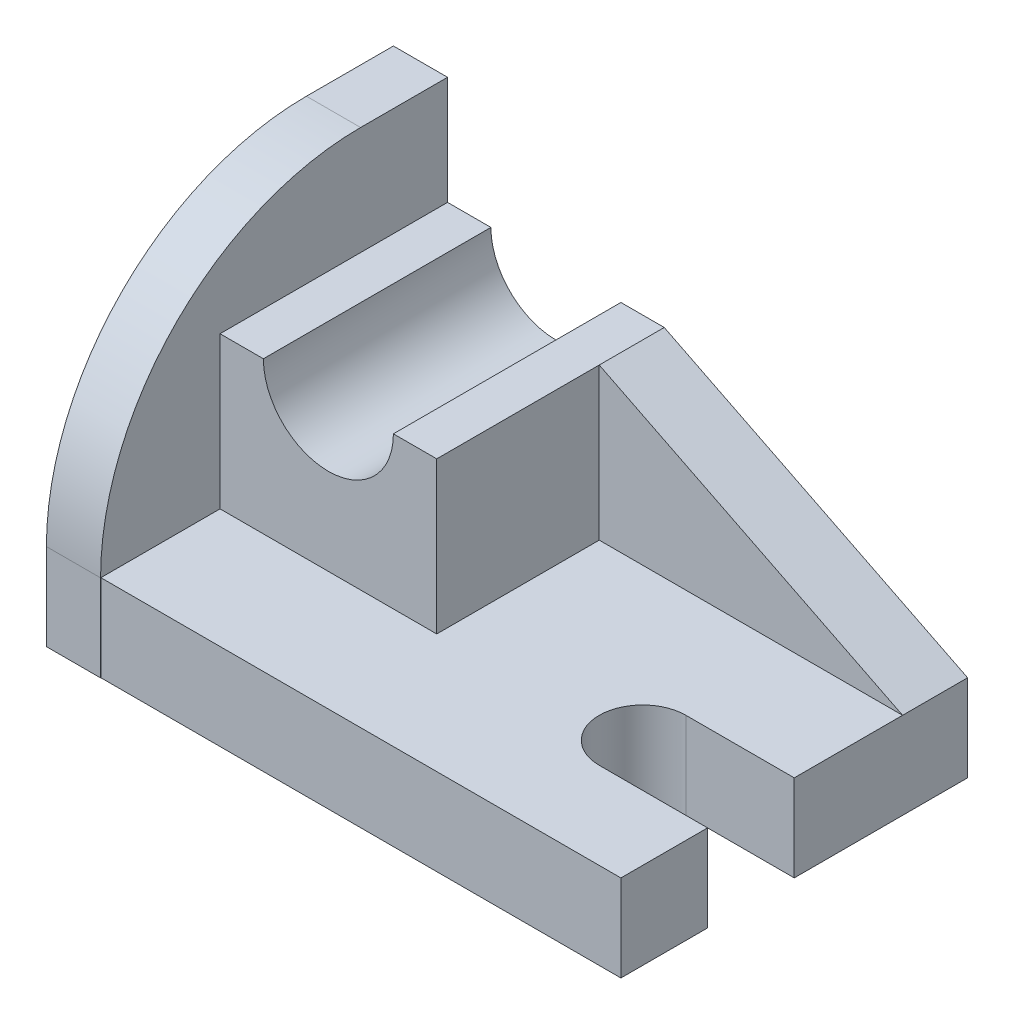
ISO-10303-21;
HEADER;
FILE_DESCRIPTION(('STEP AP214'),'2;1');
FILE_NAME('part.step','',(''),(''),'','','');
FILE_SCHEMA(('AUTOMOTIVE_DESIGN { 1 0 10303 214 1 1 1 1 }'));
ENDSEC;
DATA;
#1=APPLICATION_CONTEXT('core data for automotive mechanical design processes');
#2=APPLICATION_PROTOCOL_DEFINITION('international standard','automotive_design',2000,#1);
#3=PRODUCT_CONTEXT('',#1,'mechanical');
#4=PRODUCT('Part','Part','',(#3));
#5=PRODUCT_RELATED_PRODUCT_CATEGORY('part','',(#4));
#6=PRODUCT_DEFINITION_FORMATION('','',#4);
#7=PRODUCT_DEFINITION_CONTEXT('part definition',#1,'design');
#8=PRODUCT_DEFINITION('design','',#6,#7);
#9=PRODUCT_DEFINITION_SHAPE('','',#8);
#10=(LENGTH_UNIT() NAMED_UNIT(*) SI_UNIT(.MILLI.,.METRE.));
#11=(NAMED_UNIT(*) PLANE_ANGLE_UNIT() SI_UNIT($,.RADIAN.));
#12=(NAMED_UNIT(*) SI_UNIT($,.STERADIAN.) SOLID_ANGLE_UNIT());
#13=UNCERTAINTY_MEASURE_WITH_UNIT(LENGTH_MEASURE(1.E-05),#10,'distance_accuracy_value','');
#14=(GEOMETRIC_REPRESENTATION_CONTEXT(3) GLOBAL_UNCERTAINTY_ASSIGNED_CONTEXT((#13)) GLOBAL_UNIT_ASSIGNED_CONTEXT((#10,
#11,#12)) REPRESENTATION_CONTEXT('',''));
#15=CARTESIAN_POINT('',(0.,0.,0.));
#16=DIRECTION('',(0.,0.,1.));
#17=DIRECTION('',(1.,0.,0.));
#18=AXIS2_PLACEMENT_3D('',#15,#16,#17);
#19=CARTESIAN_POINT('',(0.,406.4,0.));
#20=DIRECTION('',(0.,-1.,0.));
#21=DIRECTION('',(0.,0.,-1.));
#22=AXIS2_PLACEMENT_3D('',#19,#20,#21);
#23=PLANE('',#22);
#24=DIRECTION('',(-1.,0.,0.));
#25=VECTOR('',#24,1.);
#26=CARTESIAN_POINT('',(2451.4745308311,406.4,-793.460589812333));
#27=LINE('',#26,#25);
#28=CARTESIAN_POINT('',(2451.4745308311,406.4,-793.460589812333));
#29=VERTEX_POINT('',#28);
#30=CARTESIAN_POINT('',(1029.0745308311,406.4,-793.460589812333));
#31=VERTEX_POINT('',#30);
#32=EDGE_CURVE('E166',#29,#31,#27,.T.);
#33=ORIENTED_EDGE('',*,*,#32,.T.);
#34=DIRECTION('',(0.,0.,-1.));
#35=VECTOR('',#34,1.);
#36=CARTESIAN_POINT('',(1029.0745308311,406.4,-1098.26058981233));
#37=LINE('',#36,#35);
#38=CARTESIAN_POINT('',(1029.0745308311,406.4,-31.4605898123326));
#39=VERTEX_POINT('',#38);
#40=EDGE_CURVE('E61',#39,#31,#37,.T.);
#41=ORIENTED_EDGE('',*,*,#40,.F.);
#42=DIRECTION('',(1.,0.,0.));
#43=VECTOR('',#42,1.);
#44=CARTESIAN_POINT('',(13.0745308310987,406.4,-31.4605898123326));
#45=LINE('',#44,#43);
#46=CARTESIAN_POINT('',(13.0745308310987,406.4,-31.4605898123326));
#47=VERTEX_POINT('',#46);
#48=EDGE_CURVE('E185',#47,#39,#45,.T.);
#49=ORIENTED_EDGE('',*,*,#48,.F.);
#50=DIRECTION('',(0.,0.,1.));
#51=VECTOR('',#50,1.);
#52=CARTESIAN_POINT('',(13.0745308310987,406.4,527.339410187667));
#53=LINE('',#52,#51);
#54=CARTESIAN_POINT('',(13.0745308310987,406.4,527.339410187667));
#55=VERTEX_POINT('',#54);
#56=EDGE_CURVE('E260',#47,#55,#53,.T.);
#57=ORIENTED_EDGE('',*,*,#56,.T.);
#58=DIRECTION('',(1.,0.,0.));
#59=VECTOR('',#58,1.);
#60=CARTESIAN_POINT('',(13.0745308310987,406.4,527.339410187667));
#61=LINE('',#60,#59);
#62=CARTESIAN_POINT('',(2451.4745308311,406.4,527.339410187667));
#63=VERTEX_POINT('',#62);
#64=EDGE_CURVE('E262',#55,#63,#61,.T.);
#65=ORIENTED_EDGE('',*,*,#64,.T.);
#66=DIRECTION('',(0.,0.,-1.));
#67=VECTOR('',#66,1.);
#68=CARTESIAN_POINT('',(2451.4745308311,406.4,527.339410187667));
#69=LINE('',#68,#67);
#70=CARTESIAN_POINT('',(2451.4745308311,406.4,120.939410187667));
#71=VERTEX_POINT('',#70);
#72=EDGE_CURVE('E265',#63,#71,#69,.T.);
#73=ORIENTED_EDGE('',*,*,#72,.T.);
#74=DIRECTION('',(1.,0.,0.));
#75=VECTOR('',#74,1.);
#76=CARTESIAN_POINT('',(2451.4745308311,406.4,120.939410187667));
#77=LINE('',#76,#75);
#78=CARTESIAN_POINT('',(1943.4745308311,406.4,120.939410187667));
#79=VERTEX_POINT('',#78);
#80=EDGE_CURVE('E238',#79,#71,#77,.T.);
#81=ORIENTED_EDGE('',*,*,#80,.F.);
#82=CARTESIAN_POINT('',(1943.4745308311,406.4,-82.2605898123326));
#83=DIRECTION('',(0.,1.,0.));
#84=DIRECTION('',(0.,0.,1.));
#85=AXIS2_PLACEMENT_3D('',#82,#83,#84);
#86=CIRCLE('',#85,203.2);
#87=CARTESIAN_POINT('',(1943.4745308311,406.4,-285.460589812333));
#88=VERTEX_POINT('',#87);
#89=EDGE_CURVE('E247',#88,#79,#86,.T.);
#90=ORIENTED_EDGE('',*,*,#89,.F.);
#91=DIRECTION('',(-1.,0.,0.));
#92=VECTOR('',#91,1.);
#93=CARTESIAN_POINT('',(2451.4745308311,406.4,-285.460589812333));
#94=LINE('',#93,#92);
#95=CARTESIAN_POINT('',(2451.4745308311,406.4,-285.460589812333));
#96=VERTEX_POINT('',#95);
#97=EDGE_CURVE('E233',#96,#88,#94,.T.);
#98=ORIENTED_EDGE('',*,*,#97,.F.);
#99=EDGE_CURVE('E177',#96,#29,#69,.T.);
#100=ORIENTED_EDGE('',*,*,#99,.T.);
#101=EDGE_LOOP('',(#33,#41,#49,#57,#65,#73,#81,#90,#98,#100));
#102=FACE_BOUND('',#101,.T.);
#103=ADVANCED_FACE('F39',(#102),#23,.F.);
#104=CARTESIAN_POINT('',(1029.0745308311,1117.6,-1098.26058981233));
#105=DIRECTION('',(-1.,0.,0.));
#106=DIRECTION('',(0.,0.,1.));
#107=AXIS2_PLACEMENT_3D('',#104,#105,#106);
#108=PLANE('',#107);
#109=DIRECTION('',(0.,1.,0.));
#110=VECTOR('',#109,1.);
#111=CARTESIAN_POINT('',(1029.0745308311,406.4,-793.460589812333));
#112=LINE('',#111,#110);
#113=CARTESIAN_POINT('',(1029.0745308311,1117.6,-793.460589812333));
#114=VERTEX_POINT('',#113);
#115=EDGE_CURVE('E164',#31,#114,#112,.T.);
#116=ORIENTED_EDGE('',*,*,#115,.T.);
#117=DIRECTION('',(0.,0.,-1.));
#118=VECTOR('',#117,1.);
#119=CARTESIAN_POINT('',(1029.0745308311,1117.6,-1098.26058981233));
#120=LINE('',#119,#118);
#121=CARTESIAN_POINT('',(1029.0745308311,1117.6,-31.4605898123326));
#122=VERTEX_POINT('',#121);
#123=EDGE_CURVE('E298',#122,#114,#120,.T.);
#124=ORIENTED_EDGE('',*,*,#123,.F.);
#125=DIRECTION('',(0.,-1.,0.));
#126=VECTOR('',#125,1.);
#127=CARTESIAN_POINT('',(1029.0745308311,1117.6,-31.4605898123326));
#128=LINE('',#127,#126);
#129=EDGE_CURVE('E183',#122,#39,#128,.T.);
#130=ORIENTED_EDGE('',*,*,#129,.T.);
#131=ORIENTED_EDGE('',*,*,#40,.T.);
#132=EDGE_LOOP('',(#116,#124,#130,#131));
#133=FACE_BOUND('',#132,.T.);
#134=ADVANCED_FACE('F181',(#133),#108,.F.);
#135=CARTESIAN_POINT('',(0.,1117.6,0.));
#136=DIRECTION('',(0.,1.,0.));
#137=DIRECTION('',(0.,0.,1.));
#138=AXIS2_PLACEMENT_3D('',#135,#136,#137);
#139=PLANE('',#138);
#140=DIRECTION('',(0.,0.,1.));
#141=VECTOR('',#140,1.);
#142=CARTESIAN_POINT('',(216.274530831099,1117.6,-1098.26058981233));
#143=LINE('',#142,#141);
#144=CARTESIAN_POINT('',(216.274530831099,1117.6,-1098.26058981233));
#145=VERTEX_POINT('',#144);
#146=CARTESIAN_POINT('',(216.274530831099,1117.6,-31.4605898123326));
#147=VERTEX_POINT('',#146);
#148=EDGE_CURVE('E11',#145,#147,#143,.T.);
#149=ORIENTED_EDGE('',*,*,#148,.F.);
#150=DIRECTION('',(-1.,0.,0.));
#151=VECTOR('',#150,1.);
#152=CARTESIAN_POINT('',(13.0745308310987,1117.6,-1098.26058981233));
#153=LINE('',#152,#151);
#154=CARTESIAN_POINT('',(13.0745308310987,1117.6,-1098.26058981233));
#155=VERTEX_POINT('',#154);
#156=EDGE_CURVE('E293',#145,#155,#153,.T.);
#157=ORIENTED_EDGE('',*,*,#156,.T.);
#158=DIRECTION('',(0.,0.,1.));
#159=VECTOR('',#158,1.);
#160=CARTESIAN_POINT('',(13.0745308310987,1117.6,-1098.26058981233));
#161=LINE('',#160,#159);
#162=CARTESIAN_POINT('',(13.0745308310987,1117.6,-31.4605898123326));
#163=VERTEX_POINT('',#162);
#164=EDGE_CURVE('E184',#155,#163,#161,.T.);
#165=ORIENTED_EDGE('',*,*,#164,.T.);
#166=DIRECTION('',(1.,0.,0.));
#167=VECTOR('',#166,1.);
#168=CARTESIAN_POINT('',(13.0745308310987,1117.6,-31.4605898123326));
#169=LINE('',#168,#167);
#170=EDGE_CURVE('E301',#163,#147,#169,.T.);
#171=ORIENTED_EDGE('',*,*,#170,.T.);
#172=EDGE_LOOP('',(#149,#157,#165,#171));
#173=FACE_BOUND('',#172,.T.);
#174=ADVANCED_FACE('F340',(#173),#139,.T.);
#175=CARTESIAN_POINT('',(13.0745308310987,406.4,-690.477583060082));
#176=DIRECTION('',(1.,0.,0.));
#177=DIRECTION('',(0.,0.,-1.));
#178=AXIS2_PLACEMENT_3D('',#175,#176,#177);
#179=PLANE('',#178);
#180=ORIENTED_EDGE('',*,*,#56,.F.);
#181=DIRECTION('',(0.,-1.,0.));
#182=VECTOR('',#181,1.);
#183=CARTESIAN_POINT('',(13.0745308310987,1117.6,-31.4605898123326));
#184=LINE('',#183,#182);
#185=EDGE_CURVE('E195',#163,#47,#184,.T.);
#186=ORIENTED_EDGE('',*,*,#185,.F.);
#187=ORIENTED_EDGE('',*,*,#164,.F.);
#188=DIRECTION('',(0.,-1.,0.));
#189=VECTOR('',#188,1.);
#190=CARTESIAN_POINT('',(13.0745308310987,0.,-1098.26058981233));
#191=LINE('',#190,#189);
#192=CARTESIAN_POINT('',(13.0745308310987,1625.6,-1098.26058981233));
#193=VERTEX_POINT('',#192);
#194=EDGE_CURVE('E199',#193,#155,#191,.T.);
#195=ORIENTED_EDGE('',*,*,#194,.F.);
#196=DIRECTION('',(0.,0.,-1.));
#197=VECTOR('',#196,1.);
#198=CARTESIAN_POINT('',(13.0745308310987,1625.6,-1098.26058981233));
#199=LINE('',#198,#197);
#200=CARTESIAN_POINT('',(13.0745308310987,1625.6,-690.477583060091));
#201=VERTEX_POINT('',#200);
#202=EDGE_CURVE('E204',#201,#193,#199,.T.);
#203=ORIENTED_EDGE('',*,*,#202,.F.);
#204=CARTESIAN_POINT('',(13.0745308310987,406.4,-690.477583060082));
#205=DIRECTION('',(-1.,0.,0.));
#206=DIRECTION('',(0.,0.,-1.));
#207=AXIS2_PLACEMENT_3D('',#204,#205,#206);
#208=CIRCLE('',#207,1219.2);
#209=CARTESIAN_POINT('',(13.0745308310987,406.399999999991,528.722416939918));
#210=VERTEX_POINT('',#209);
#211=EDGE_CURVE('E219',#210,#201,#208,.T.);
#212=ORIENTED_EDGE('',*,*,#211,.F.);
#213=DIRECTION('',(0.,1.,0.));
#214=VECTOR('',#213,1.);
#215=CARTESIAN_POINT('',(13.0745308310987,0.,528.722416939918));
#216=LINE('',#215,#214);
#217=CARTESIAN_POINT('',(13.0745308310987,0.,528.722416939918));
#218=VERTEX_POINT('',#217);
#219=EDGE_CURVE('E217',#218,#210,#216,.T.);
#220=ORIENTED_EDGE('',*,*,#219,.F.);
#221=DIRECTION('',(0.,0.,1.));
#222=VECTOR('',#221,1.);
#223=CARTESIAN_POINT('',(13.0745308310987,0.,-1098.26058981233));
#224=LINE('',#223,#222);
#225=CARTESIAN_POINT('',(13.0745308310987,0.,527.339410187667));
#226=VERTEX_POINT('',#225);
#227=EDGE_CURVE('E215',#226,#218,#224,.T.);
#228=ORIENTED_EDGE('',*,*,#227,.F.);
#229=DIRECTION('',(0.,-1.,0.));
#230=VECTOR('',#229,1.);
#231=CARTESIAN_POINT('',(13.0745308310987,406.4,527.339410187667));
#232=LINE('',#231,#230);
#233=EDGE_CURVE('E280',#55,#226,#232,.T.);
#234=ORIENTED_EDGE('',*,*,#233,.F.);
#235=EDGE_LOOP('',(#180,#186,#187,#195,#203,#212,#220,#228,#234));
#236=FACE_BOUND('',#235,.T.);
#237=ADVANCED_FACE('F335',(#236),#179,.T.);
#238=CARTESIAN_POINT('',(2451.4745308311,406.4,527.339410187667));
#239=DIRECTION('',(-1.,0.,0.));
#240=DIRECTION('',(0.,0.,1.));
#241=AXIS2_PLACEMENT_3D('',#238,#239,#240);
#242=PLANE('',#241);
#243=DIRECTION('',(0.,0.,-1.));
#244=VECTOR('',#243,1.);
#245=CARTESIAN_POINT('',(2451.4745308311,0.,527.339410187667));
#246=LINE('',#245,#244);
#247=CARTESIAN_POINT('',(2451.4745308311,0.,527.339410187667));
#248=VERTEX_POINT('',#247);
#249=CARTESIAN_POINT('',(2451.4745308311,0.,120.939410187667));
#250=VERTEX_POINT('',#249);
#251=EDGE_CURVE('E271',#248,#250,#246,.T.);
#252=ORIENTED_EDGE('',*,*,#251,.T.);
#253=DIRECTION('',(0.,1.,0.));
#254=VECTOR('',#253,1.);
#255=CARTESIAN_POINT('',(2451.4745308311,0.,120.939410187667));
#256=LINE('',#255,#254);
#257=EDGE_CURVE('E251',#250,#71,#256,.T.);
#258=ORIENTED_EDGE('',*,*,#257,.T.);
#259=ORIENTED_EDGE('',*,*,#72,.F.);
#260=DIRECTION('',(0.,-1.,0.));
#261=VECTOR('',#260,1.);
#262=CARTESIAN_POINT('',(2451.4745308311,406.4,527.339410187667));
#263=LINE('',#262,#261);
#264=EDGE_CURVE('E277',#63,#248,#263,.T.);
#265=ORIENTED_EDGE('',*,*,#264,.T.);
#266=EDGE_LOOP('',(#252,#258,#259,#265));
#267=FACE_BOUND('',#266,.T.);
#268=ADVANCED_FACE('F352',(#267),#242,.F.);
#269=CARTESIAN_POINT('',(13.0745308310987,406.4,527.339410187667));
#270=DIRECTION('',(0.,0.,-1.));
#271=DIRECTION('',(-1.,0.,0.));
#272=AXIS2_PLACEMENT_3D('',#269,#270,#271);
#273=PLANE('',#272);
#274=DIRECTION('',(1.,0.,0.));
#275=VECTOR('',#274,1.);
#276=CARTESIAN_POINT('',(13.0745308310987,0.,527.339410187667));
#277=LINE('',#276,#275);
#278=EDGE_CURVE('E254',#226,#248,#277,.T.);
#279=ORIENTED_EDGE('',*,*,#278,.T.);
#280=ORIENTED_EDGE('',*,*,#264,.F.);
#281=ORIENTED_EDGE('',*,*,#64,.F.);
#282=ORIENTED_EDGE('',*,*,#233,.T.);
#283=EDGE_LOOP('',(#279,#280,#281,#282));
#284=FACE_BOUND('',#283,.T.);
#285=ADVANCED_FACE('F41',(#284),#273,.F.);
#286=ORIENTED_EDGE('',*,*,#99,.F.);
#287=DIRECTION('',(0.,1.,0.));
#288=VECTOR('',#287,1.);
#289=CARTESIAN_POINT('',(2451.4745308311,0.,-285.460589812333));
#290=LINE('',#289,#288);
#291=CARTESIAN_POINT('',(2451.4745308311,0.,-285.460589812333));
#292=VERTEX_POINT('',#291);
#293=EDGE_CURVE('E244',#292,#96,#290,.T.);
#294=ORIENTED_EDGE('',*,*,#293,.F.);
#295=CARTESIAN_POINT('',(2451.4745308311,0.,-1098.26058981233));
#296=VERTEX_POINT('',#295);
#297=EDGE_CURVE('E270',#292,#296,#246,.T.);
#298=ORIENTED_EDGE('',*,*,#297,.T.);
#299=DIRECTION('',(0.,-1.,0.));
#300=VECTOR('',#299,1.);
#301=CARTESIAN_POINT('',(2451.4745308311,406.4,-1098.26058981233));
#302=LINE('',#301,#300);
#303=CARTESIAN_POINT('',(2451.4745308311,406.4,-1098.26058981233));
#304=VERTEX_POINT('',#303);
#305=EDGE_CURVE('E268',#304,#296,#302,.T.);
#306=ORIENTED_EDGE('',*,*,#305,.F.);
#307=DIRECTION('',(0.,0.,-1.));
#308=VECTOR('',#307,1.);
#309=CARTESIAN_POINT('',(2451.4745308311,406.4,-793.460589812333));
#310=LINE('',#309,#308);
#311=EDGE_CURVE('E304',#29,#304,#310,.T.);
#312=ORIENTED_EDGE('',*,*,#311,.F.);
#313=EDGE_LOOP('',(#286,#294,#298,#306,#312));
#314=FACE_BOUND('',#313,.T.);
#315=ADVANCED_FACE('F314',(#314),#242,.F.);
#316=CARTESIAN_POINT('',(13.0745308310987,406.4,-1098.26058981233));
#317=DIRECTION('',(0.,0.,1.));
#318=DIRECTION('',(1.,0.,0.));
#319=AXIS2_PLACEMENT_3D('',#316,#317,#318);
#320=PLANE('',#319);
#321=ORIENTED_EDGE('',*,*,#156,.F.);
#322=CARTESIAN_POINT('',(521.074530831099,1117.6,-1098.26058981233));
#323=DIRECTION('',(0.,0.,1.));
#324=DIRECTION('',(1.,0.,0.));
#325=AXIS2_PLACEMENT_3D('',#322,#323,#324);
#326=CIRCLE('',#325,304.8);
#327=CARTESIAN_POINT('',(825.874530831099,1117.6,-1098.26058981233));
#328=VERTEX_POINT('',#327);
#329=EDGE_CURVE('E190',#145,#328,#326,.T.);
#330=ORIENTED_EDGE('',*,*,#329,.T.);
#331=CARTESIAN_POINT('',(1029.0745308311,1117.6,-1098.26058981233));
#332=VERTEX_POINT('',#331);
#333=EDGE_CURVE('E196',#332,#328,#153,.T.);
#334=ORIENTED_EDGE('',*,*,#333,.F.);
#335=DIRECTION('',(-0.894427190999916,0.447213595499958,0.));
#336=VECTOR('',#335,1.);
#337=CARTESIAN_POINT('',(2451.4745308311,406.4,-1098.26058981233));
#338=LINE('',#337,#336);
#339=EDGE_CURVE('E178',#304,#332,#338,.T.);
#340=ORIENTED_EDGE('',*,*,#339,.F.);
#341=ORIENTED_EDGE('',*,*,#305,.T.);
#342=DIRECTION('',(-1.,0.,0.));
#343=VECTOR('',#342,1.);
#344=CARTESIAN_POINT('',(13.0745308310987,0.,-1098.26058981233));
#345=LINE('',#344,#343);
#346=CARTESIAN_POINT('',(-240.925469168901,0.,-1098.26058981233));
#347=VERTEX_POINT('',#346);
#348=EDGE_CURVE('E263',#296,#347,#345,.T.);
#349=ORIENTED_EDGE('',*,*,#348,.T.);
#350=DIRECTION('',(0.,-1.,0.));
#351=VECTOR('',#350,1.);
#352=CARTESIAN_POINT('',(-240.925469168901,0.,-1098.26058981233));
#353=LINE('',#352,#351);
#354=CARTESIAN_POINT('',(-240.925469168901,1625.6,-1098.26058981233));
#355=VERTEX_POINT('',#354);
#356=EDGE_CURVE('E200',#355,#347,#353,.T.);
#357=ORIENTED_EDGE('',*,*,#356,.F.);
#358=DIRECTION('',(1.,0.,0.));
#359=VECTOR('',#358,1.);
#360=CARTESIAN_POINT('',(-240.925469168901,1625.6,-1098.26058981233));
#361=LINE('',#360,#359);
#362=EDGE_CURVE('E212',#355,#193,#361,.T.);
#363=ORIENTED_EDGE('',*,*,#362,.T.);
#364=ORIENTED_EDGE('',*,*,#194,.T.);
#365=EDGE_LOOP('',(#321,#330,#334,#340,#341,#349,#357,#363,#364));
#366=FACE_BOUND('',#365,.T.);
#367=ADVANCED_FACE('F291',(#366),#320,.F.);
#368=CARTESIAN_POINT('',(0.,0.,0.));
#369=DIRECTION('',(0.,-1.,0.));
#370=DIRECTION('',(0.,0.,-1.));
#371=AXIS2_PLACEMENT_3D('',#368,#369,#370);
#372=PLANE('',#371);
#373=DIRECTION('',(1.,0.,0.));
#374=VECTOR('',#373,1.);
#375=CARTESIAN_POINT('',(2451.4745308311,0.,120.939410187667));
#376=LINE('',#375,#374);
#377=CARTESIAN_POINT('',(1943.4745308311,0.,120.939410187667));
#378=VERTEX_POINT('',#377);
#379=EDGE_CURVE('E241',#378,#250,#376,.T.);
#380=ORIENTED_EDGE('',*,*,#379,.T.);
#381=ORIENTED_EDGE('',*,*,#251,.F.);
#382=ORIENTED_EDGE('',*,*,#278,.F.);
#383=ORIENTED_EDGE('',*,*,#227,.T.);
#384=DIRECTION('',(1.,0.,0.));
#385=VECTOR('',#384,1.);
#386=CARTESIAN_POINT('',(-240.925469168901,0.,528.722416939918));
#387=LINE('',#386,#385);
#388=CARTESIAN_POINT('',(-240.925469168901,0.,528.722416939918));
#389=VERTEX_POINT('',#388);
#390=EDGE_CURVE('E230',#389,#218,#387,.T.);
#391=ORIENTED_EDGE('',*,*,#390,.F.);
#392=DIRECTION('',(0.,0.,1.));
#393=VECTOR('',#392,1.);
#394=CARTESIAN_POINT('',(-240.925469168901,0.,-1098.26058981233));
#395=LINE('',#394,#393);
#396=EDGE_CURVE('E203',#347,#389,#395,.T.);
#397=ORIENTED_EDGE('',*,*,#396,.F.);
#398=ORIENTED_EDGE('',*,*,#348,.F.);
#399=ORIENTED_EDGE('',*,*,#297,.F.);
#400=DIRECTION('',(-1.,0.,0.));
#401=VECTOR('',#400,1.);
#402=CARTESIAN_POINT('',(2451.4745308311,0.,-285.460589812333));
#403=LINE('',#402,#401);
#404=CARTESIAN_POINT('',(1943.4745308311,0.,-285.460589812333));
#405=VERTEX_POINT('',#404);
#406=EDGE_CURVE('E234',#292,#405,#403,.T.);
#407=ORIENTED_EDGE('',*,*,#406,.T.);
#408=CARTESIAN_POINT('',(1943.4745308311,0.,-82.2605898123326));
#409=DIRECTION('',(0.,1.,0.));
#410=DIRECTION('',(0.,0.,1.));
#411=AXIS2_PLACEMENT_3D('',#408,#409,#410);
#412=CIRCLE('',#411,203.2);
#413=EDGE_CURVE('E237',#405,#378,#412,.T.);
#414=ORIENTED_EDGE('',*,*,#413,.T.);
#415=EDGE_LOOP('',(#380,#381,#382,#383,#391,#397,#398,#399,#407,#414));
#416=FACE_BOUND('',#415,.T.);
#417=ADVANCED_FACE('F318',(#416),#372,.T.);
#418=CARTESIAN_POINT('',(2451.4745308311,0.,120.939410187667));
#419=DIRECTION('',(0.,0.,1.));
#420=DIRECTION('',(1.,0.,0.));
#421=AXIS2_PLACEMENT_3D('',#418,#419,#420);
#422=PLANE('',#421);
#423=ORIENTED_EDGE('',*,*,#80,.T.);
#424=ORIENTED_EDGE('',*,*,#257,.F.);
#425=ORIENTED_EDGE('',*,*,#379,.F.);
#426=DIRECTION('',(0.,1.,0.));
#427=VECTOR('',#426,1.);
#428=CARTESIAN_POINT('',(1943.4745308311,0.,120.939410187667));
#429=LINE('',#428,#427);
#430=EDGE_CURVE('E255',#378,#79,#429,.T.);
#431=ORIENTED_EDGE('',*,*,#430,.T.);
#432=EDGE_LOOP('',(#423,#424,#425,#431));
#433=FACE_BOUND('',#432,.T.);
#434=ADVANCED_FACE('F356',(#433),#422,.F.);
#435=CARTESIAN_POINT('',(1943.4745308311,0.,-82.2605898123326));
#436=DIRECTION('',(0.,1.,0.));
#437=DIRECTION('',(0.,0.,1.));
#438=AXIS2_PLACEMENT_3D('',#435,#436,#437);
#439=CYLINDRICAL_SURFACE('',#438,203.2);
#440=ORIENTED_EDGE('',*,*,#89,.T.);
#441=ORIENTED_EDGE('',*,*,#430,.F.);
#442=ORIENTED_EDGE('',*,*,#413,.F.);
#443=DIRECTION('',(0.,1.,0.));
#444=VECTOR('',#443,1.);
#445=CARTESIAN_POINT('',(1943.4745308311,0.,-285.460589812333));
#446=LINE('',#445,#444);
#447=EDGE_CURVE('E257',#405,#88,#446,.T.);
#448=ORIENTED_EDGE('',*,*,#447,.T.);
#449=EDGE_LOOP('',(#440,#441,#442,#448));
#450=FACE_BOUND('',#449,.T.);
#451=ADVANCED_FACE('F359',(#450),#439,.F.);
#452=CARTESIAN_POINT('',(2451.4745308311,0.,-285.460589812333));
#453=DIRECTION('',(0.,0.,-1.));
#454=DIRECTION('',(-1.,0.,0.));
#455=AXIS2_PLACEMENT_3D('',#452,#453,#454);
#456=PLANE('',#455);
#457=ORIENTED_EDGE('',*,*,#97,.T.);
#458=ORIENTED_EDGE('',*,*,#447,.F.);
#459=ORIENTED_EDGE('',*,*,#406,.F.);
#460=ORIENTED_EDGE('',*,*,#293,.T.);
#461=EDGE_LOOP('',(#457,#458,#459,#460));
#462=FACE_BOUND('',#461,.T.);
#463=ADVANCED_FACE('F361',(#462),#456,.F.);
#464=CARTESIAN_POINT('',(-240.925469168901,0.,528.722416939918));
#465=DIRECTION('',(0.,0.,-1.));
#466=DIRECTION('',(-1.,0.,0.));
#467=AXIS2_PLACEMENT_3D('',#464,#465,#466);
#468=PLANE('',#467);
#469=ORIENTED_EDGE('',*,*,#219,.T.);
#470=DIRECTION('',(1.,0.,0.));
#471=VECTOR('',#470,1.);
#472=CARTESIAN_POINT('',(-240.925469168901,406.399999999991,528.722416939918));
#473=LINE('',#472,#471);
#474=CARTESIAN_POINT('',(-240.925469168901,406.399999999991,528.722416939918));
#475=VERTEX_POINT('',#474);
#476=EDGE_CURVE('E227',#475,#210,#473,.T.);
#477=ORIENTED_EDGE('',*,*,#476,.F.);
#478=DIRECTION('',(0.,1.,0.));
#479=VECTOR('',#478,1.);
#480=CARTESIAN_POINT('',(-240.925469168901,0.,528.722416939918));
#481=LINE('',#480,#479);
#482=EDGE_CURVE('E206',#389,#475,#481,.T.);
#483=ORIENTED_EDGE('',*,*,#482,.F.);
#484=ORIENTED_EDGE('',*,*,#390,.T.);
#485=EDGE_LOOP('',(#469,#477,#483,#484));
#486=FACE_BOUND('',#485,.T.);
#487=ADVANCED_FACE('F363',(#486),#468,.F.);
#488=CARTESIAN_POINT('',(-240.925469168901,406.4,-690.477583060082));
#489=DIRECTION('',(1.,0.,0.));
#490=DIRECTION('',(0.,0.,-1.));
#491=AXIS2_PLACEMENT_3D('',#488,#489,#490);
#492=CYLINDRICAL_SURFACE('',#491,1219.2);
#493=ORIENTED_EDGE('',*,*,#211,.T.);
#494=DIRECTION('',(1.,0.,0.));
#495=VECTOR('',#494,1.);
#496=CARTESIAN_POINT('',(-240.925469168901,1625.6,-690.477583060091));
#497=LINE('',#496,#495);
#498=CARTESIAN_POINT('',(-240.925469168901,1625.6,-690.477583060091));
#499=VERTEX_POINT('',#498);
#500=EDGE_CURVE('E224',#499,#201,#497,.T.);
#501=ORIENTED_EDGE('',*,*,#500,.F.);
#502=CARTESIAN_POINT('',(-240.925469168901,406.4,-690.477583060082));
#503=DIRECTION('',(-1.,0.,0.));
#504=DIRECTION('',(0.,0.,-1.));
#505=AXIS2_PLACEMENT_3D('',#502,#503,#504);
#506=CIRCLE('',#505,1219.2);
#507=EDGE_CURVE('E208',#475,#499,#506,.T.);
#508=ORIENTED_EDGE('',*,*,#507,.F.);
#509=ORIENTED_EDGE('',*,*,#476,.T.);
#510=EDGE_LOOP('',(#493,#501,#508,#509));
#511=FACE_BOUND('',#510,.T.);
#512=ADVANCED_FACE('F369',(#511),#492,.T.);
#513=CARTESIAN_POINT('',(-240.925469168901,1625.6,-1098.26058981233));
#514=DIRECTION('',(0.,-1.,0.));
#515=DIRECTION('',(0.,0.,-1.));
#516=AXIS2_PLACEMENT_3D('',#513,#514,#515);
#517=PLANE('',#516);
#518=ORIENTED_EDGE('',*,*,#202,.T.);
#519=ORIENTED_EDGE('',*,*,#362,.F.);
#520=DIRECTION('',(0.,0.,-1.));
#521=VECTOR('',#520,1.);
#522=CARTESIAN_POINT('',(-240.925469168901,1625.6,-1098.26058981233));
#523=LINE('',#522,#521);
#524=EDGE_CURVE('E210',#499,#355,#523,.T.);
#525=ORIENTED_EDGE('',*,*,#524,.F.);
#526=ORIENTED_EDGE('',*,*,#500,.T.);
#527=EDGE_LOOP('',(#518,#519,#525,#526));
#528=FACE_BOUND('',#527,.T.);
#529=ADVANCED_FACE('F330',(#528),#517,.F.);
#530=CARTESIAN_POINT('',(-240.925469168901,406.4,-690.477583060082));
#531=DIRECTION('',(1.,0.,0.));
#532=DIRECTION('',(0.,0.,-1.));
#533=AXIS2_PLACEMENT_3D('',#530,#531,#532);
#534=PLANE('',#533);
#535=ORIENTED_EDGE('',*,*,#356,.T.);
#536=ORIENTED_EDGE('',*,*,#396,.T.);
#537=ORIENTED_EDGE('',*,*,#482,.T.);
#538=ORIENTED_EDGE('',*,*,#507,.T.);
#539=ORIENTED_EDGE('',*,*,#524,.T.);
#540=EDGE_LOOP('',(#535,#536,#537,#538,#539));
#541=FACE_BOUND('',#540,.T.);
#542=ADVANCED_FACE('F325',(#541),#534,.F.);
#543=CARTESIAN_POINT('',(13.0745308310987,1117.6,-31.4605898123326));
#544=DIRECTION('',(0.,0.,-1.));
#545=DIRECTION('',(-1.,0.,0.));
#546=AXIS2_PLACEMENT_3D('',#543,#544,#545);
#547=PLANE('',#546);
#548=CARTESIAN_POINT('',(825.874530831099,1117.6,-31.4605898123326));
#549=VERTEX_POINT('',#548);
#550=EDGE_CURVE('E188',#549,#122,#169,.T.);
#551=ORIENTED_EDGE('',*,*,#550,.F.);
#552=CARTESIAN_POINT('',(521.074530831099,1117.6,-31.4605898123326));
#553=DIRECTION('',(0.,0.,1.));
#554=DIRECTION('',(1.,0.,0.));
#555=AXIS2_PLACEMENT_3D('',#552,#553,#554);
#556=CIRCLE('',#555,304.8);
#557=EDGE_CURVE('E53',#147,#549,#556,.T.);
#558=ORIENTED_EDGE('',*,*,#557,.F.);
#559=ORIENTED_EDGE('',*,*,#170,.F.);
#560=ORIENTED_EDGE('',*,*,#185,.T.);
#561=ORIENTED_EDGE('',*,*,#48,.T.);
#562=ORIENTED_EDGE('',*,*,#129,.F.);
#563=EDGE_LOOP('',(#551,#558,#559,#560,#561,#562));
#564=FACE_BOUND('',#563,.T.);
#565=ADVANCED_FACE('F342',(#564),#547,.F.);
#566=DIRECTION('',(0.,0.,1.));
#567=VECTOR('',#566,1.);
#568=CARTESIAN_POINT('',(825.874530831099,1117.6,-1098.26058981233));
#569=LINE('',#568,#567);
#570=EDGE_CURVE('E47',#549,#328,#569,.F.);
#571=ORIENTED_EDGE('',*,*,#570,.F.);
#572=ORIENTED_EDGE('',*,*,#550,.T.);
#573=ORIENTED_EDGE('',*,*,#123,.T.);
#574=DIRECTION('',(0.,0.,-1.));
#575=VECTOR('',#574,1.);
#576=CARTESIAN_POINT('',(1029.0745308311,1117.6,-793.460589812333));
#577=LINE('',#576,#575);
#578=EDGE_CURVE('E297',#114,#332,#577,.T.);
#579=ORIENTED_EDGE('',*,*,#578,.T.);
#580=ORIENTED_EDGE('',*,*,#333,.T.);
#581=EDGE_LOOP('',(#571,#572,#573,#579,#580));
#582=FACE_BOUND('',#581,.T.);
#583=ADVANCED_FACE('F296',(#582),#139,.T.);
#584=CARTESIAN_POINT('',(521.074530831099,1117.6,-1098.26058981233));
#585=DIRECTION('',(0.,0.,1.));
#586=DIRECTION('',(1.,0.,0.));
#587=AXIS2_PLACEMENT_3D('',#584,#585,#586);
#588=CYLINDRICAL_SURFACE('',#587,304.8);
#589=ORIENTED_EDGE('',*,*,#148,.T.);
#590=ORIENTED_EDGE('',*,*,#557,.T.);
#591=ORIENTED_EDGE('',*,*,#570,.T.);
#592=ORIENTED_EDGE('',*,*,#329,.F.);
#593=EDGE_LOOP('',(#589,#590,#591,#592));
#594=FACE_BOUND('',#593,.T.);
#595=ADVANCED_FACE('F283',(#594),#588,.F.);
#596=CARTESIAN_POINT('',(2451.4745308311,406.4,-793.460589812333));
#597=DIRECTION('',(-0.447213595499958,-0.894427190999916,0.));
#598=DIRECTION('',(0.894427190999916,-0.447213595499958,0.));
#599=AXIS2_PLACEMENT_3D('',#596,#597,#598);
#600=PLANE('',#599);
#601=ORIENTED_EDGE('',*,*,#339,.T.);
#602=ORIENTED_EDGE('',*,*,#578,.F.);
#603=DIRECTION('',(-0.894427190999916,0.447213595499958,0.));
#604=VECTOR('',#603,1.);
#605=CARTESIAN_POINT('',(2451.4745308311,406.4,-793.460589812333));
#606=LINE('',#605,#604);
#607=EDGE_CURVE('E168',#29,#114,#606,.T.);
#608=ORIENTED_EDGE('',*,*,#607,.F.);
#609=ORIENTED_EDGE('',*,*,#311,.T.);
#610=EDGE_LOOP('',(#601,#602,#608,#609));
#611=FACE_BOUND('',#610,.T.);
#612=ADVANCED_FACE('F310',(#611),#600,.F.);
#613=CARTESIAN_POINT('',(0.,0.,-793.460589812333));
#614=DIRECTION('',(0.,0.,-1.));
#615=DIRECTION('',(-1.,0.,0.));
#616=AXIS2_PLACEMENT_3D('',#613,#614,#615);
#617=PLANE('',#616);
#618=ORIENTED_EDGE('',*,*,#32,.F.);
#619=ORIENTED_EDGE('',*,*,#607,.T.);
#620=ORIENTED_EDGE('',*,*,#115,.F.);
#621=EDGE_LOOP('',(#618,#619,#620));
#622=FACE_BOUND('',#621,.T.);
#623=ADVANCED_FACE('F165',(#622),#617,.F.);
#624=CLOSED_SHELL('',(#103,#134,#174,#237,#268,#285,#315,#367,#417,#434,#451,#463,#487,#512,
#529,#542,#565,#583,#595,#612,#623));
#625=MANIFOLD_SOLID_BREP('B2',#624);
#626=ADVANCED_BREP_SHAPE_REPRESENTATION('',(#18,#625),#14);
#627=SHAPE_DEFINITION_REPRESENTATION(#9,#626);
ENDSEC;
END-ISO-10303-21;
